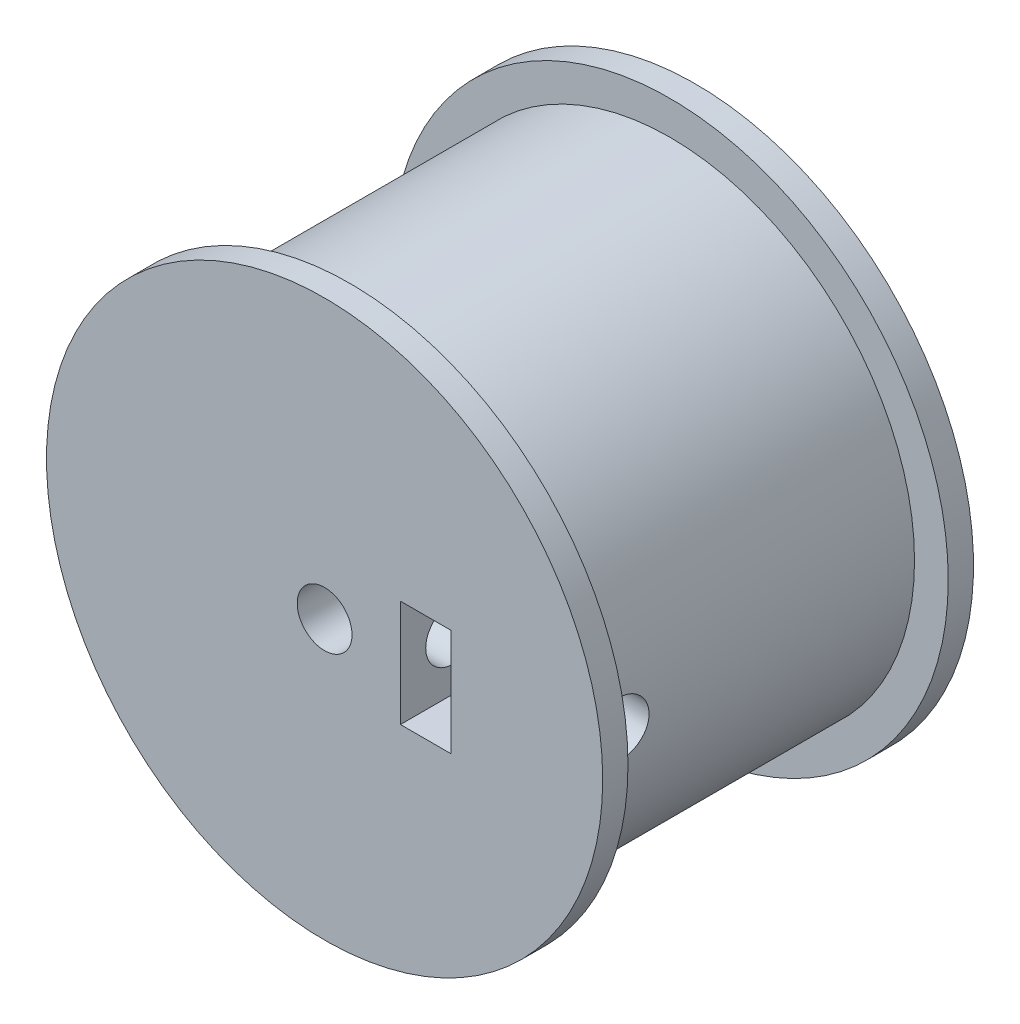
ISO-10303-21;
HEADER;
FILE_DESCRIPTION(('STEP AP214'),'2;1');
FILE_NAME('part.step','',(''),(''),'','','');
FILE_SCHEMA(('AUTOMOTIVE_DESIGN { 1 0 10303 214 1 1 1 1 }'));
ENDSEC;
DATA;
#1=APPLICATION_CONTEXT('core data for automotive mechanical design processes');
#2=APPLICATION_PROTOCOL_DEFINITION('international standard','automotive_design',2000,#1);
#3=PRODUCT_CONTEXT('',#1,'mechanical');
#4=PRODUCT('Part','Part','',(#3));
#5=PRODUCT_RELATED_PRODUCT_CATEGORY('part','',(#4));
#6=PRODUCT_DEFINITION_FORMATION('','',#4);
#7=PRODUCT_DEFINITION_CONTEXT('part definition',#1,'design');
#8=PRODUCT_DEFINITION('design','',#6,#7);
#9=PRODUCT_DEFINITION_SHAPE('','',#8);
#10=(LENGTH_UNIT() NAMED_UNIT(*) SI_UNIT(.MILLI.,.METRE.));
#11=(NAMED_UNIT(*) PLANE_ANGLE_UNIT() SI_UNIT($,.RADIAN.));
#12=(NAMED_UNIT(*) SI_UNIT($,.STERADIAN.) SOLID_ANGLE_UNIT());
#13=UNCERTAINTY_MEASURE_WITH_UNIT(LENGTH_MEASURE(1.E-05),#10,'distance_accuracy_value','');
#14=(GEOMETRIC_REPRESENTATION_CONTEXT(3) GLOBAL_UNCERTAINTY_ASSIGNED_CONTEXT((#13)) GLOBAL_UNIT_ASSIGNED_CONTEXT((#10,
#11,#12)) REPRESENTATION_CONTEXT('',''));
#15=CARTESIAN_POINT('',(0.,0.,0.));
#16=DIRECTION('',(0.,0.,1.));
#17=DIRECTION('',(1.,0.,0.));
#18=AXIS2_PLACEMENT_3D('',#15,#16,#17);
#19=CARTESIAN_POINT('',(-6.3474692202458,-2.91837665298638,-16.75));
#20=DIRECTION('',(0.,0.,-1.));
#21=DIRECTION('',(-1.,0.,0.));
#22=AXIS2_PLACEMENT_3D('',#19,#20,#21);
#23=CYLINDRICAL_SURFACE('',#22,16.5);
#24=CARTESIAN_POINT('',(-6.3474692202458,-2.91837665298638,-22.));
#25=DIRECTION('',(0.,0.,-1.));
#26=DIRECTION('',(-1.,0.,0.));
#27=AXIS2_PLACEMENT_3D('',#24,#25,#26);
#28=CIRCLE('',#27,16.5);
#29=CARTESIAN_POINT('',(-22.8474692202458,-2.91837665298638,-22.));
#30=VERTEX_POINT('',#29);
#31=EDGE_CURVE('E240',#30,#30,#28,.T.);
#32=ORIENTED_EDGE('',*,*,#31,.F.);
#33=EDGE_LOOP('',(#32));
#34=FACE_BOUND('',#33,.T.);
#35=CARTESIAN_POINT('',(-6.3474692202458,-2.91837665298638,-20.5));
#36=DIRECTION('',(0.,0.,1.));
#37=DIRECTION('',(1.,0.,0.));
#38=AXIS2_PLACEMENT_3D('',#35,#36,#37);
#39=CIRCLE('',#38,16.5);
#40=CARTESIAN_POINT('',(10.1525307797542,-2.91837665298638,-20.5));
#41=VERTEX_POINT('',#40);
#42=EDGE_CURVE('E241',#41,#41,#39,.T.);
#43=ORIENTED_EDGE('',*,*,#42,.F.);
#44=EDGE_LOOP('',(#43));
#45=FACE_BOUND('',#44,.T.);
#46=ADVANCED_FACE('F33',(#34,#45),#23,.T.);
#47=CARTESIAN_POINT('',(-6.3474692202458,-2.91837665298638,0.));
#48=DIRECTION('',(0.,0.,1.));
#49=DIRECTION('',(1.,0.,0.));
#50=AXIS2_PLACEMENT_3D('',#47,#48,#49);
#51=PLANE('',#50);
#52=CARTESIAN_POINT('',(-6.3474692202458,-2.91837665298638,0.));
#53=DIRECTION('',(0.,0.,1.));
#54=DIRECTION('',(1.,0.,0.));
#55=AXIS2_PLACEMENT_3D('',#52,#53,#54);
#56=CIRCLE('',#55,1.625);
#57=CARTESIAN_POINT('',(-4.7224692202458,-2.91837665298638,0.));
#58=VERTEX_POINT('',#57);
#59=EDGE_CURVE('E251',#58,#58,#56,.T.);
#60=ORIENTED_EDGE('',*,*,#59,.F.);
#61=EDGE_LOOP('',(#60));
#62=FACE_BOUND('',#61,.T.);
#63=DIRECTION('',(0.,1.,0.));
#64=VECTOR('',#63,1.);
#65=CARTESIAN_POINT('',(1.15253077975413,0.25162334701362,0.));
#66=LINE('',#65,#64);
#67=CARTESIAN_POINT('',(1.15253077975413,-6.08837665298638,0.));
#68=VERTEX_POINT('',#67);
#69=CARTESIAN_POINT('',(1.15253077975413,0.25162334701362,0.));
#70=VERTEX_POINT('',#69);
#71=EDGE_CURVE('E130',#68,#70,#66,.T.);
#72=ORIENTED_EDGE('',*,*,#71,.F.);
#73=DIRECTION('',(1.,0.,0.));
#74=VECTOR('',#73,1.);
#75=CARTESIAN_POINT('',(-1.84746922024587,-6.08837665298638,0.));
#76=LINE('',#75,#74);
#77=CARTESIAN_POINT('',(-1.84746922024587,-6.08837665298638,0.));
#78=VERTEX_POINT('',#77);
#79=EDGE_CURVE('E135',#78,#68,#76,.T.);
#80=ORIENTED_EDGE('',*,*,#79,.F.);
#81=DIRECTION('',(0.,-1.,0.));
#82=VECTOR('',#81,1.);
#83=CARTESIAN_POINT('',(-1.84746922024587,0.25162334701362,0.));
#84=LINE('',#83,#82);
#85=CARTESIAN_POINT('',(-1.84746922024587,0.25162334701362,0.));
#86=VERTEX_POINT('',#85);
#87=EDGE_CURVE('E149',#86,#78,#84,.T.);
#88=ORIENTED_EDGE('',*,*,#87,.F.);
#89=DIRECTION('',(-1.,0.,0.));
#90=VECTOR('',#89,1.);
#91=CARTESIAN_POINT('',(-1.84746922024587,0.25162334701362,0.));
#92=LINE('',#91,#90);
#93=EDGE_CURVE('E146',#70,#86,#92,.T.);
#94=ORIENTED_EDGE('',*,*,#93,.F.);
#95=EDGE_LOOP('',(#72,#80,#88,#94));
#96=FACE_BOUND('',#95,.T.);
#97=CARTESIAN_POINT('',(-6.3474692202458,-2.91837665298638,0.));
#98=DIRECTION('',(0.,0.,1.));
#99=DIRECTION('',(1.,0.,0.));
#100=AXIS2_PLACEMENT_3D('',#97,#98,#99);
#101=CIRCLE('',#100,16.5);
#102=CARTESIAN_POINT('',(10.1525307797542,-2.91837665298638,0.));
#103=VERTEX_POINT('',#102);
#104=EDGE_CURVE('E156',#103,#103,#101,.T.);
#105=ORIENTED_EDGE('',*,*,#104,.T.);
#106=EDGE_LOOP('',(#105));
#107=FACE_BOUND('',#106,.T.);
#108=ADVANCED_FACE('F35',(#62,#96,#107),#51,.T.);
#109=CARTESIAN_POINT('',(-6.34746922024578,-2.91837665298637,-8.25));
#110=DIRECTION('',(0.,0.,-1.));
#111=DIRECTION('',(-1.,0.,0.));
#112=AXIS2_PLACEMENT_3D('',#109,#110,#111);
#113=PLANE('',#112);
#114=CARTESIAN_POINT('',(-6.3474692202458,-2.91837665298638,-8.25));
#115=DIRECTION('',(0.,0.,-1.));
#116=DIRECTION('',(-1.,0.,0.));
#117=AXIS2_PLACEMENT_3D('',#114,#115,#116);
#118=CIRCLE('',#117,1.625);
#119=CARTESIAN_POINT('',(-7.9724692202458,-2.91837665298638,-8.25));
#120=VERTEX_POINT('',#119);
#121=EDGE_CURVE('E116',#120,#120,#118,.F.);
#122=ORIENTED_EDGE('',*,*,#121,.T.);
#123=EDGE_LOOP('',(#122));
#124=FACE_BOUND('',#123,.T.);
#125=CARTESIAN_POINT('',(-6.34746922024578,-2.91837665298637,-8.25));
#126=DIRECTION('',(0.,0.,-1.));
#127=DIRECTION('',(-1.,0.,0.));
#128=AXIS2_PLACEMENT_3D('',#125,#126,#127);
#129=CIRCLE('',#128,9.);
#130=CARTESIAN_POINT('',(-15.3474692202458,-2.91837665298637,-8.25));
#131=VERTEX_POINT('',#130);
#132=EDGE_CURVE('E110',#131,#131,#129,.T.);
#133=ORIENTED_EDGE('',*,*,#132,.T.);
#134=EDGE_LOOP('',(#133));
#135=FACE_BOUND('',#134,.T.);
#136=ADVANCED_FACE('F219',(#124,#135),#113,.T.);
#137=CARTESIAN_POINT('',(-6.34746922024578,-2.91837665298637,-8.25));
#138=DIRECTION('',(0.,0.,-1.));
#139=DIRECTION('',(-1.,0.,0.));
#140=AXIS2_PLACEMENT_3D('',#137,#138,#139);
#141=CYLINDRICAL_SURFACE('',#140,9.);
#142=ORIENTED_EDGE('',*,*,#132,.F.);
#143=EDGE_LOOP('',(#142));
#144=FACE_BOUND('',#143,.T.);
#145=CARTESIAN_POINT('',(-6.3474692202458,-2.91837665298638,-22.));
#146=DIRECTION('',(0.,0.,-1.));
#147=DIRECTION('',(-1.,0.,0.));
#148=AXIS2_PLACEMENT_3D('',#145,#146,#147);
#149=CIRCLE('',#148,8.99999999999998);
#150=CARTESIAN_POINT('',(-15.3474692202458,-2.91837665298638,-22.));
#151=VERTEX_POINT('',#150);
#152=EDGE_CURVE('E238',#151,#151,#149,.T.);
#153=ORIENTED_EDGE('',*,*,#152,.T.);
#154=EDGE_LOOP('',(#153));
#155=FACE_BOUND('',#154,.T.);
#156=ADVANCED_FACE('F226',(#144,#155),#141,.F.);
#157=CARTESIAN_POINT('',(-6.3474692202458,-2.91837665298638,-1.5));
#158=DIRECTION('',(0.,0.,1.));
#159=DIRECTION('',(1.,0.,0.));
#160=AXIS2_PLACEMENT_3D('',#157,#158,#159);
#161=CYLINDRICAL_SURFACE('',#160,16.5);
#162=CARTESIAN_POINT('',(-6.3474692202458,-2.91837665298638,-1.5));
#163=DIRECTION('',(0.,0.,1.));
#164=DIRECTION('',(1.,0.,0.));
#165=AXIS2_PLACEMENT_3D('',#162,#163,#164);
#166=CIRCLE('',#165,16.5);
#167=CARTESIAN_POINT('',(10.1525307797542,-2.91837665298638,-1.5));
#168=VERTEX_POINT('',#167);
#169=EDGE_CURVE('E163',#168,#168,#166,.T.);
#170=ORIENTED_EDGE('',*,*,#169,.T.);
#171=EDGE_LOOP('',(#170));
#172=FACE_BOUND('',#171,.T.);
#173=ORIENTED_EDGE('',*,*,#104,.F.);
#174=EDGE_LOOP('',(#173));
#175=FACE_BOUND('',#174,.T.);
#176=ADVANCED_FACE('F206',(#172,#175),#161,.T.);
#177=CARTESIAN_POINT('',(-6.3474692202458,-2.91837665298638,-1.5));
#178=DIRECTION('',(0.,0.,1.));
#179=DIRECTION('',(1.,0.,0.));
#180=AXIS2_PLACEMENT_3D('',#177,#178,#179);
#181=PLANE('',#180);
#182=ORIENTED_EDGE('',*,*,#169,.F.);
#183=EDGE_LOOP('',(#182));
#184=FACE_BOUND('',#183,.T.);
#185=CARTESIAN_POINT('',(-6.3474692202458,-2.91837665298638,-1.5));
#186=DIRECTION('',(0.,0.,1.));
#187=DIRECTION('',(1.,0.,0.));
#188=AXIS2_PLACEMENT_3D('',#185,#186,#187);
#189=CIRCLE('',#188,14.5);
#190=CARTESIAN_POINT('',(8.1525307797542,-2.91837665298638,-1.5));
#191=VERTEX_POINT('',#190);
#192=EDGE_CURVE('E51',#191,#191,#189,.T.);
#193=ORIENTED_EDGE('',*,*,#192,.T.);
#194=EDGE_LOOP('',(#193));
#195=FACE_BOUND('',#194,.T.);
#196=ADVANCED_FACE('F198',(#184,#195),#181,.F.);
#197=CARTESIAN_POINT('',(1.15253077975413,0.25162334701362,-6.25));
#198=DIRECTION('',(1.,0.,0.));
#199=DIRECTION('',(0.,1.,0.));
#200=AXIS2_PLACEMENT_3D('',#197,#198,#199);
#201=PLANE('',#200);
#202=CARTESIAN_POINT('',(1.15253077975413,-2.91837665298638,-3.125));
#203=DIRECTION('',(1.,0.,0.));
#204=DIRECTION('',(0.,1.,0.));
#205=AXIS2_PLACEMENT_3D('',#202,#203,#204);
#206=CIRCLE('',#205,1.625);
#207=CARTESIAN_POINT('',(1.15253077975413,-1.29337665298638,-3.125));
#208=VERTEX_POINT('',#207);
#209=EDGE_CURVE('E127',#208,#208,#206,.F.);
#210=ORIENTED_EDGE('',*,*,#209,.F.);
#211=EDGE_LOOP('',(#210));
#212=FACE_BOUND('',#211,.T.);
#213=ORIENTED_EDGE('',*,*,#71,.T.);
#214=DIRECTION('',(0.,0.,1.));
#215=VECTOR('',#214,1.);
#216=CARTESIAN_POINT('',(1.15253077975413,0.25162334701362,-6.25));
#217=LINE('',#216,#215);
#218=CARTESIAN_POINT('',(1.15253077975413,0.25162334701362,-6.25));
#219=VERTEX_POINT('',#218);
#220=EDGE_CURVE('E144',#219,#70,#217,.T.);
#221=ORIENTED_EDGE('',*,*,#220,.F.);
#222=DIRECTION('',(0.,1.,0.));
#223=VECTOR('',#222,1.);
#224=CARTESIAN_POINT('',(1.15253077975413,0.25162334701362,-6.25));
#225=LINE('',#224,#223);
#226=CARTESIAN_POINT('',(1.15253077975413,-6.08837665298638,-6.25));
#227=VERTEX_POINT('',#226);
#228=EDGE_CURVE('E131',#227,#219,#225,.T.);
#229=ORIENTED_EDGE('',*,*,#228,.F.);
#230=DIRECTION('',(0.,0.,1.));
#231=VECTOR('',#230,1.);
#232=CARTESIAN_POINT('',(1.15253077975413,-6.08837665298638,-6.25));
#233=LINE('',#232,#231);
#234=EDGE_CURVE('E154',#227,#68,#233,.T.);
#235=ORIENTED_EDGE('',*,*,#234,.T.);
#236=EDGE_LOOP('',(#213,#221,#229,#235));
#237=FACE_BOUND('',#236,.T.);
#238=ADVANCED_FACE('F196',(#212,#237),#201,.F.);
#239=CARTESIAN_POINT('',(-1.84746922024587,-6.08837665298638,-6.25));
#240=DIRECTION('',(0.,-1.,0.));
#241=DIRECTION('',(0.,0.,-1.));
#242=AXIS2_PLACEMENT_3D('',#239,#240,#241);
#243=PLANE('',#242);
#244=ORIENTED_EDGE('',*,*,#79,.T.);
#245=ORIENTED_EDGE('',*,*,#234,.F.);
#246=DIRECTION('',(1.,0.,0.));
#247=VECTOR('',#246,1.);
#248=CARTESIAN_POINT('',(-1.84746922024587,-6.08837665298638,-6.25));
#249=LINE('',#248,#247);
#250=CARTESIAN_POINT('',(-1.84746922024587,-6.08837665298638,-6.25));
#251=VERTEX_POINT('',#250);
#252=EDGE_CURVE('E141',#251,#227,#249,.T.);
#253=ORIENTED_EDGE('',*,*,#252,.F.);
#254=DIRECTION('',(0.,0.,1.));
#255=VECTOR('',#254,1.);
#256=CARTESIAN_POINT('',(-1.84746922024587,-6.08837665298638,-6.25));
#257=LINE('',#256,#255);
#258=EDGE_CURVE('E157',#251,#78,#257,.T.);
#259=ORIENTED_EDGE('',*,*,#258,.T.);
#260=EDGE_LOOP('',(#244,#245,#253,#259));
#261=FACE_BOUND('',#260,.T.);
#262=ADVANCED_FACE('F179',(#261),#243,.F.);
#263=CARTESIAN_POINT('',(-1.84746922024587,0.25162334701362,-6.25));
#264=DIRECTION('',(-1.,0.,0.));
#265=DIRECTION('',(0.,0.,1.));
#266=AXIS2_PLACEMENT_3D('',#263,#264,#265);
#267=PLANE('',#266);
#268=CARTESIAN_POINT('',(-1.84746922024587,-2.91837665298638,-3.125));
#269=DIRECTION('',(-1.,0.,0.));
#270=DIRECTION('',(0.,0.,1.));
#271=AXIS2_PLACEMENT_3D('',#268,#269,#270);
#272=CIRCLE('',#271,1.625);
#273=CARTESIAN_POINT('',(-1.84746922024587,-2.91837665298638,-1.5));
#274=VERTEX_POINT('',#273);
#275=EDGE_CURVE('E122',#274,#274,#272,.F.);
#276=ORIENTED_EDGE('',*,*,#275,.F.);
#277=EDGE_LOOP('',(#276));
#278=FACE_BOUND('',#277,.T.);
#279=ORIENTED_EDGE('',*,*,#87,.T.);
#280=ORIENTED_EDGE('',*,*,#258,.F.);
#281=DIRECTION('',(0.,-1.,0.));
#282=VECTOR('',#281,1.);
#283=CARTESIAN_POINT('',(-1.84746922024587,0.25162334701362,-6.25));
#284=LINE('',#283,#282);
#285=CARTESIAN_POINT('',(-1.84746922024587,0.25162334701362,-6.25));
#286=VERTEX_POINT('',#285);
#287=EDGE_CURVE('E138',#286,#251,#284,.T.);
#288=ORIENTED_EDGE('',*,*,#287,.F.);
#289=DIRECTION('',(0.,0.,1.));
#290=VECTOR('',#289,1.);
#291=CARTESIAN_POINT('',(-1.84746922024587,0.25162334701362,-6.25));
#292=LINE('',#291,#290);
#293=EDGE_CURVE('E159',#286,#86,#292,.T.);
#294=ORIENTED_EDGE('',*,*,#293,.T.);
#295=EDGE_LOOP('',(#279,#280,#288,#294));
#296=FACE_BOUND('',#295,.T.);
#297=ADVANCED_FACE('F175',(#278,#296),#267,.F.);
#298=CARTESIAN_POINT('',(-1.84746922024587,0.25162334701362,-6.25));
#299=DIRECTION('',(0.,1.,0.));
#300=DIRECTION('',(0.,0.,1.));
#301=AXIS2_PLACEMENT_3D('',#298,#299,#300);
#302=PLANE('',#301);
#303=ORIENTED_EDGE('',*,*,#93,.T.);
#304=ORIENTED_EDGE('',*,*,#293,.F.);
#305=DIRECTION('',(-1.,0.,0.));
#306=VECTOR('',#305,1.);
#307=CARTESIAN_POINT('',(-1.84746922024587,0.25162334701362,-6.25));
#308=LINE('',#307,#306);
#309=EDGE_CURVE('E134',#219,#286,#308,.T.);
#310=ORIENTED_EDGE('',*,*,#309,.F.);
#311=ORIENTED_EDGE('',*,*,#220,.T.);
#312=EDGE_LOOP('',(#303,#304,#310,#311));
#313=FACE_BOUND('',#312,.T.);
#314=ADVANCED_FACE('F178',(#313),#302,.F.);
#315=CARTESIAN_POINT('',(0.,0.,-6.25));
#316=DIRECTION('',(0.,0.,1.));
#317=DIRECTION('',(1.,0.,0.));
#318=AXIS2_PLACEMENT_3D('',#315,#316,#317);
#319=PLANE('',#318);
#320=ORIENTED_EDGE('',*,*,#228,.T.);
#321=ORIENTED_EDGE('',*,*,#309,.T.);
#322=ORIENTED_EDGE('',*,*,#287,.T.);
#323=ORIENTED_EDGE('',*,*,#252,.T.);
#324=EDGE_LOOP('',(#320,#321,#322,#323));
#325=FACE_BOUND('',#324,.T.);
#326=ADVANCED_FACE('F192',(#325),#319,.T.);
#327=CARTESIAN_POINT('',(-6.84746922024587,-2.91837665298638,-3.125));
#328=DIRECTION('',(1.,0.,0.));
#329=DIRECTION('',(0.,1.,0.));
#330=AXIS2_PLACEMENT_3D('',#327,#328,#329);
#331=CYLINDRICAL_SURFACE('',#330,1.625);
#332=CARTESIAN_POINT('',(-6.3474692202458,-2.91837665298638,-3.125));
#333=DIRECTION('',(0.707106781186547,0.,0.707106781186547));
#334=DIRECTION('',(0.707106781186547,0.,-0.707106781186547));
#335=AXIS2_PLACEMENT_3D('',#332,#333,#334);
#336=ELLIPSE('',#335,2.29809703885628,1.625);
#337=CARTESIAN_POINT('',(-6.3474692202458,-4.54337665298638,-3.125));
#338=VERTEX_POINT('',#337);
#339=CARTESIAN_POINT('',(-6.3474692202458,-1.29337665298638,-3.125));
#340=VERTEX_POINT('',#339);
#341=EDGE_CURVE('E257',#338,#340,#336,.T.);
#342=ORIENTED_EDGE('',*,*,#341,.F.);
#343=CARTESIAN_POINT('',(-6.3474692202458,-2.91837665298638,-3.125));
#344=DIRECTION('',(0.707106781186547,0.,-0.707106781186547));
#345=DIRECTION('',(0.707106781186547,0.,0.707106781186547));
#346=AXIS2_PLACEMENT_3D('',#343,#344,#345);
#347=ELLIPSE('',#346,2.29809703885628,1.625);
#348=EDGE_CURVE('E115',#340,#338,#347,.T.);
#349=ORIENTED_EDGE('',*,*,#348,.F.);
#350=EDGE_LOOP('',(#342,#349));
#351=FACE_BOUND('',#350,.T.);
#352=ORIENTED_EDGE('',*,*,#275,.T.);
#353=EDGE_LOOP('',(#352));
#354=FACE_BOUND('',#353,.T.);
#355=ADVANCED_FACE('F173',(#351,#354),#331,.F.);
#356=CARTESIAN_POINT('',(8.06118703216026,-1.29337665298638,-3.125));
#357=CARTESIAN_POINT('',(8.06118821730652,-1.2933805621844,-3.21596893246536));
#358=CARTESIAN_POINT('',(8.06205782223678,-1.30104118390368,-3.30699651724397));
#359=CARTESIAN_POINT('',(8.06544142265403,-1.33148273980317,-3.48652357779885));
#360=CARTESIAN_POINT('',(8.06795718755764,-1.35427994430998,-3.57502022618366));
#361=CARTESIAN_POINT('',(8.07434465095267,-1.41431868857663,-3.74685985539876));
#362=CARTESIAN_POINT('',(8.07821548257328,-1.45155099546564,-3.83020609106982));
#363=CARTESIAN_POINT('',(8.08687587862318,-1.53938435248499,-3.98944996980594));
#364=CARTESIAN_POINT('',(8.09166527214061,-1.58998291628808,-4.06534899456826));
#365=CARTESIAN_POINT('',(8.10164743812413,-1.70335822741611,-4.20790449998324));
#366=CARTESIAN_POINT('',(8.10684176062769,-1.76618330218758,-4.27452244095678));
#367=CARTESIAN_POINT('',(8.11703451136958,-1.902124562804,-4.39629237425084));
#368=CARTESIAN_POINT('',(8.12203293028568,-1.9752412376245,-4.45144382146556));
#369=CARTESIAN_POINT('',(8.1312862909416,-2.12992945587988,-4.54885101940402));
#370=CARTESIAN_POINT('',(8.13553923065156,-2.2115228568227,-4.59107226551521));
#371=CARTESIAN_POINT('',(8.14280548738144,-2.38069719602271,-4.66119970449329));
#372=CARTESIAN_POINT('',(8.14581884178524,-2.46827795361797,-4.68910632907234));
#373=CARTESIAN_POINT('',(8.15025550470991,-2.6465489291665,-4.7296982387461));
#374=CARTESIAN_POINT('',(8.15168546755436,-2.73722447046062,-4.7424472416979));
#375=CARTESIAN_POINT('',(8.15281690591307,-2.91943864185276,-4.7525593102492));
#376=CARTESIAN_POINT('',(8.15251843681451,-3.01097724420034,-4.74992286887157));
#377=CARTESIAN_POINT('',(8.15023205771013,-3.19188610610169,-4.72939030863942));
#378=CARTESIAN_POINT('',(8.14825173387745,-3.28126425176298,-4.71156270981009));
#379=CARTESIAN_POINT('',(8.14283278009884,-3.45575195148259,-4.66126080678621));
#380=CARTESIAN_POINT('',(8.13939412712797,-3.54086143812113,-4.62878627133687));
#381=CARTESIAN_POINT('',(8.13143193113011,-3.70461010384237,-4.55003823211697));
#382=CARTESIAN_POINT('',(8.12690603244005,-3.78323472876908,-4.50373471227842));
#383=CARTESIAN_POINT('',(8.11727651783081,-3.9316230168079,-4.39866490203063));
#384=CARTESIAN_POINT('',(8.11217288061337,-4.00138635304856,-4.3398981520964));
#385=CARTESIAN_POINT('',(8.10192680801525,-4.13047363438095,-4.21118541139039));
#386=CARTESIAN_POINT('',(8.09678431354667,-4.18973810620976,-4.14117976298906));
#387=CARTESIAN_POINT('',(8.08706795872933,-4.29568410612939,-3.99218239667336));
#388=CARTESIAN_POINT('',(8.08249409959202,-4.34236560741324,-3.91319065961539));
#389=CARTESIAN_POINT('',(8.07443271681189,-4.42182193402341,-3.74841438342106));
#390=CARTESIAN_POINT('',(8.07094551893644,-4.45459259011812,-3.66262781692857));
#391=CARTESIAN_POINT('',(8.06545887939952,-4.50524734990409,-3.48672187939574));
#392=CARTESIAN_POINT('',(8.06345938049525,-4.52313202637237,-3.39660267520613));
#393=CARTESIAN_POINT('',(8.06118472426947,-4.54342961748276,-3.21511315946483));
#394=CARTESIAN_POINT('',(8.06090026905408,-4.54592595970202,-3.12375229029858));
#395=CARTESIAN_POINT('',(8.06206334939624,-4.53559558723165,-2.94191360417765));
#396=CARTESIAN_POINT('',(8.06351085542985,-4.52276913374266,-2.85143577219675));
#397=CARTESIAN_POINT('',(8.0679662929734,-4.48222726990286,-2.67417777677528));
#398=CARTESIAN_POINT('',(8.07097004419792,-4.45455173913162,-2.58738837812607));
#399=CARTESIAN_POINT('',(8.07819614050027,-4.38513819308596,-2.41968297597673));
#400=CARTESIAN_POINT('',(8.08241852034955,-4.34339977654584,-2.33876714015097));
#401=CARTESIAN_POINT('',(8.09162852645264,-4.24683803119588,-2.18472677869576));
#402=CARTESIAN_POINT('',(8.09661933824203,-4.19195967950242,-2.11163693819996));
#403=CARTESIAN_POINT('',(8.10679364771528,-4.07075422764078,-1.97567603830383));
#404=CARTESIAN_POINT('',(8.11197715139865,-4.00442677076731,-1.91280529740562));
#405=CARTESIAN_POINT('',(8.12198109752454,-3.86184281968816,-1.79877712105008));
#406=CARTESIAN_POINT('',(8.12679978043758,-3.7855425149293,-1.74767429137935));
#407=CARTESIAN_POINT('',(8.13550523274524,-3.62539361641045,-1.65900925906142));
#408=CARTESIAN_POINT('',(8.13939201770236,-3.54154514873536,-1.62144683028709));
#409=CARTESIAN_POINT('',(8.14578786152963,-3.36886650098909,-1.56102031690975));
#410=CARTESIAN_POINT('',(8.14829994907445,-3.28004775137048,-1.53812390162576));
#411=CARTESIAN_POINT('',(8.15167585402821,-3.09979671393772,-1.50757399140939));
#412=CARTESIAN_POINT('',(8.15253973047613,-3.00836451985634,-1.49991995049417));
#413=CARTESIAN_POINT('',(8.1525217361706,-2.82601690192684,-1.50008087712359));
#414=CARTESIAN_POINT('',(8.15164940232765,-2.73510139084984,-1.50781133839617));
#415=CARTESIAN_POINT('',(8.14827587124695,-2.55586972131297,-1.53834381565374));
#416=CARTESIAN_POINT('',(8.14577467371955,-2.46755356331532,-1.56114583431876));
#417=CARTESIAN_POINT('',(8.13942341471245,-2.29603304432383,-1.62114928453721));
#418=CARTESIAN_POINT('',(8.1355736534918,-2.21282755027855,-1.65834751095374));
#419=CARTESIAN_POINT('',(8.12695310094908,-2.05382719572967,-1.74607864322876));
#420=CARTESIAN_POINT('',(8.12218230749144,-1.9780323524096,-1.79661158000624));
#421=CARTESIAN_POINT('',(8.11222195558175,-1.83557217611496,-1.90989294025769));
#422=CARTESIAN_POINT('',(8.10703032292137,-1.76895705573381,-1.97270433005357));
#423=CARTESIAN_POINT('',(8.09683059760407,-1.6471774249482,-2.10863144914116));
#424=CARTESIAN_POINT('',(8.09182254900137,-1.59201564835403,-2.18174963159544));
#425=CARTESIAN_POINT('',(8.08254029882478,-1.49456617262933,-2.33647183078791));
#426=CARTESIAN_POINT('',(8.07826844292014,-1.45231930398317,-2.41810168833808));
#427=CARTESIAN_POINT('',(8.0709699233474,-1.38219077678154,-2.58729570566158));
#428=CARTESIAN_POINT('',(8.0679418787258,-1.35429317808095,-2.67485315772159));
#429=CARTESIAN_POINT('',(8.06422461186101,-1.32048612592899,-2.82323969085395));
#430=CARTESIAN_POINT('',(8.06309103522922,-1.31033429352148,-2.88312554787091));
#431=CARTESIAN_POINT('',(8.06157185221481,-1.29677827226572,-3.00366557374875));
#432=CARTESIAN_POINT('',(8.06118624161579,-1.2933740453801,-3.06431973827661));
#433=CARTESIAN_POINT('',(8.06118703216026,-1.29337665298638,-3.125));
#434=B_SPLINE_CURVE_WITH_KNOTS('',3,(#356,#357,#358,#359,#360,#361,#362,#363,#364,#365,#366,
#367,#368,#369,#370,#371,#372,#373,#374,#375,#376,#377,#378,#379,#380,#381,#382,#383,#384,#385,
#386,#387,#388,#389,#390,#391,#392,#393,#394,#395,#396,#397,#398,#399,#400,#401,#402,#403,#404,
#405,#406,#407,#408,#409,#410,#411,#412,#413,#414,#415,#416,#417,#418,#419,#420,#421,#422,#423,
#424,#425,#426,#427,#428,#429,#430,#431,#432,#433),.UNSPECIFIED.,.T.,.F.,(4,2,2,2,2,2,2,2,2,2,2,
2,2,2,2,2,2,2,2,2,2,2,2,2,2,2,2,2,2,2,2,2,2,2,2,2,2,2,4),(0.,0.272685168043581,0.54566392116846,
0.818468360974102,1.09122209069109,1.36507666634524,1.63894425780061,1.91353642953136,
2.18812031939816,2.46154581747448,2.73496255374466,3.00715252685994,3.27934679762717,
3.55213621872476,3.82493569944217,4.09923426936701,4.37353342365725,4.64791473044206,
4.92228547919977,5.19516741417547,5.46804469752496,5.7401927668231,6.01234860216161,
6.28566464684728,6.55898920843313,6.8335575895584,7.1081213851301,7.38207781281499,
7.65602442718635,7.92847042023163,8.20091646172329,8.47330188134819,8.74568793255455,
9.01950932193337,9.29339599507281,9.56813981348659,9.84257776501583,10.0244717390713,
10.2063646877577),.UNSPECIFIED.);
#435=EDGE_CURVE('E11',#191,#191,#434,.T.);
#436=ORIENTED_EDGE('',*,*,#435,.F.);
#437=EDGE_LOOP('',(#436));
#438=FACE_BOUND('',#437,.T.);
#439=ORIENTED_EDGE('',*,*,#209,.T.);
#440=EDGE_LOOP('',(#439));
#441=FACE_BOUND('',#440,.T.);
#442=ADVANCED_FACE('F271',(#438,#441),#331,.F.);
#443=CARTESIAN_POINT('',(-6.3474692202458,-2.91837665298638,-12.8461940777126));
#444=DIRECTION('',(0.,0.,1.));
#445=DIRECTION('',(1.,0.,0.));
#446=AXIS2_PLACEMENT_3D('',#443,#444,#445);
#447=CYLINDRICAL_SURFACE('',#446,1.625);
#448=CARTESIAN_POINT('',(-6.3474692202458,-2.91837665298638,-3.125));
#449=DIRECTION('',(0.707106781186547,0.,0.707106781186547));
#450=DIRECTION('',(0.707106781186547,0.,-0.707106781186547));
#451=AXIS2_PLACEMENT_3D('',#448,#449,#450);
#452=ELLIPSE('',#451,2.29809703885628,1.625);
#453=CARTESIAN_POINT('',(-6.84746922024587,-1.37221204337978,-2.62499999999993));
#454=VERTEX_POINT('',#453);
#455=EDGE_CURVE('E120',#454,#340,#452,.F.);
#456=ORIENTED_EDGE('',*,*,#455,.T.);
#457=ORIENTED_EDGE('',*,*,#348,.T.);
#458=CARTESIAN_POINT('',(-6.84746922024587,-4.46454126259298,-2.62499999999993));
#459=VERTEX_POINT('',#458);
#460=EDGE_CURVE('E106',#338,#459,#452,.F.);
#461=ORIENTED_EDGE('',*,*,#460,.T.);
#462=DIRECTION('',(0.,0.,1.));
#463=VECTOR('',#462,1.);
#464=CARTESIAN_POINT('',(-6.84746922024587,-4.46454126259298,-12.8461940777126));
#465=LINE('',#464,#463);
#466=CARTESIAN_POINT('',(-6.84746922024587,-4.46454126259298,-3.62500000000007));
#467=VERTEX_POINT('',#466);
#468=EDGE_CURVE('E46',#467,#459,#465,.T.);
#469=ORIENTED_EDGE('',*,*,#468,.F.);
#470=CARTESIAN_POINT('',(-6.3474692202458,-2.91837665298638,-3.125));
#471=DIRECTION('',(0.707106781186547,0.,-0.707106781186547));
#472=DIRECTION('',(0.707106781186547,0.,0.707106781186547));
#473=AXIS2_PLACEMENT_3D('',#470,#471,#472);
#474=ELLIPSE('',#473,2.29809703885628,1.625);
#475=EDGE_CURVE('E104',#467,#338,#474,.F.);
#476=ORIENTED_EDGE('',*,*,#475,.T.);
#477=ORIENTED_EDGE('',*,*,#341,.T.);
#478=CARTESIAN_POINT('',(-6.84746922024587,-1.37221204337978,-3.62500000000007));
#479=VERTEX_POINT('',#478);
#480=EDGE_CURVE('E58',#340,#479,#474,.F.);
#481=ORIENTED_EDGE('',*,*,#480,.T.);
#482=DIRECTION('',(0.,0.,1.));
#483=VECTOR('',#482,1.);
#484=CARTESIAN_POINT('',(-6.84746922024587,-1.37221204337978,-12.8461940777126));
#485=LINE('',#484,#483);
#486=EDGE_CURVE('E126',#454,#479,#485,.F.);
#487=ORIENTED_EDGE('',*,*,#486,.F.);
#488=EDGE_LOOP('',(#456,#457,#461,#469,#476,#477,#481,#487));
#489=FACE_BOUND('',#488,.T.);
#490=ORIENTED_EDGE('',*,*,#59,.T.);
#491=EDGE_LOOP('',(#490));
#492=FACE_BOUND('',#491,.T.);
#493=ORIENTED_EDGE('',*,*,#121,.F.);
#494=EDGE_LOOP('',(#493));
#495=FACE_BOUND('',#494,.T.);
#496=ADVANCED_FACE('F101',(#489,#492,#495),#447,.F.);
#497=CARTESIAN_POINT('',(-6.84746922024587,-2.91837665298638,-3.125));
#498=DIRECTION('',(-1.,0.,0.));
#499=DIRECTION('',(0.,-1.,0.));
#500=AXIS2_PLACEMENT_3D('',#497,#498,#499);
#501=PLANE('',#500);
#502=CARTESIAN_POINT('',(-6.84746922024587,-2.91837665298638,-3.125));
#503=DIRECTION('',(-1.,0.,0.));
#504=DIRECTION('',(0.,-1.,0.));
#505=AXIS2_PLACEMENT_3D('',#502,#503,#504);
#506=CIRCLE('',#505,1.625);
#507=EDGE_CURVE('E119',#454,#479,#506,.T.);
#508=ORIENTED_EDGE('',*,*,#507,.F.);
#509=ORIENTED_EDGE('',*,*,#486,.T.);
#510=EDGE_LOOP('',(#508,#509));
#511=FACE_BOUND('',#510,.T.);
#512=ADVANCED_FACE('F264',(#511),#501,.F.);
#513=ORIENTED_EDGE('',*,*,#455,.F.);
#514=ORIENTED_EDGE('',*,*,#507,.T.);
#515=ORIENTED_EDGE('',*,*,#480,.F.);
#516=EDGE_LOOP('',(#513,#514,#515));
#517=FACE_BOUND('',#516,.T.);
#518=ADVANCED_FACE('F263',(#517),#331,.F.);
#519=EDGE_CURVE('E113',#467,#459,#506,.T.);
#520=ORIENTED_EDGE('',*,*,#519,.F.);
#521=ORIENTED_EDGE('',*,*,#468,.T.);
#522=EDGE_LOOP('',(#520,#521));
#523=FACE_BOUND('',#522,.T.);
#524=ADVANCED_FACE('F118',(#523),#501,.F.);
#525=ORIENTED_EDGE('',*,*,#460,.F.);
#526=ORIENTED_EDGE('',*,*,#475,.F.);
#527=ORIENTED_EDGE('',*,*,#519,.T.);
#528=EDGE_LOOP('',(#525,#526,#527));
#529=FACE_BOUND('',#528,.T.);
#530=ADVANCED_FACE('F112',(#529),#331,.F.);
#531=CARTESIAN_POINT('',(-6.3474692202458,-2.91837665298638,-1.5));
#532=DIRECTION('',(0.,0.,-1.));
#533=DIRECTION('',(-1.,0.,0.));
#534=AXIS2_PLACEMENT_3D('',#531,#532,#533);
#535=CYLINDRICAL_SURFACE('',#534,14.5);
#536=ORIENTED_EDGE('',*,*,#192,.F.);
#537=ORIENTED_EDGE('',*,*,#435,.T.);
#538=EDGE_LOOP('',(#536,#537));
#539=FACE_BOUND('',#538,.T.);
#540=CARTESIAN_POINT('',(-6.3474692202458,-2.91837665298638,-20.5));
#541=DIRECTION('',(0.,0.,1.));
#542=DIRECTION('',(1.,0.,0.));
#543=AXIS2_PLACEMENT_3D('',#540,#541,#542);
#544=CIRCLE('',#543,14.5);
#545=CARTESIAN_POINT('',(8.1525307797542,-2.91837665298638,-20.5));
#546=VERTEX_POINT('',#545);
#547=EDGE_CURVE('E246',#546,#546,#544,.T.);
#548=ORIENTED_EDGE('',*,*,#547,.T.);
#549=EDGE_LOOP('',(#548));
#550=FACE_BOUND('',#549,.T.);
#551=ADVANCED_FACE('F276',(#539,#550),#535,.T.);
#552=CARTESIAN_POINT('',(-6.3474692202458,-2.91837665298638,-22.));
#553=DIRECTION('',(0.,0.,-1.));
#554=DIRECTION('',(-1.,0.,0.));
#555=AXIS2_PLACEMENT_3D('',#552,#553,#554);
#556=PLANE('',#555);
#557=ORIENTED_EDGE('',*,*,#31,.T.);
#558=EDGE_LOOP('',(#557));
#559=FACE_BOUND('',#558,.T.);
#560=ORIENTED_EDGE('',*,*,#152,.F.);
#561=EDGE_LOOP('',(#560));
#562=FACE_BOUND('',#561,.T.);
#563=ADVANCED_FACE('F279',(#559,#562),#556,.T.);
#564=CARTESIAN_POINT('',(-6.3474692202458,-2.91837665298638,-20.5));
#565=DIRECTION('',(0.,0.,1.));
#566=DIRECTION('',(1.,0.,0.));
#567=AXIS2_PLACEMENT_3D('',#564,#565,#566);
#568=PLANE('',#567);
#569=ORIENTED_EDGE('',*,*,#547,.F.);
#570=EDGE_LOOP('',(#569));
#571=FACE_BOUND('',#570,.T.);
#572=ORIENTED_EDGE('',*,*,#42,.T.);
#573=EDGE_LOOP('',(#572));
#574=FACE_BOUND('',#573,.T.);
#575=ADVANCED_FACE('F293',(#571,#574),#568,.T.);
#576=CLOSED_SHELL('',(#46,#108,#136,#156,#176,#196,#238,#262,#297,#314,#326,#355,#442,#496,#512,
#518,#524,#530,#551,#563,#575));
#577=MANIFOLD_SOLID_BREP('B2',#576);
#578=ADVANCED_BREP_SHAPE_REPRESENTATION('',(#18,#577),#14);
#579=SHAPE_DEFINITION_REPRESENTATION(#9,#578);
ENDSEC;
END-ISO-10303-21;
